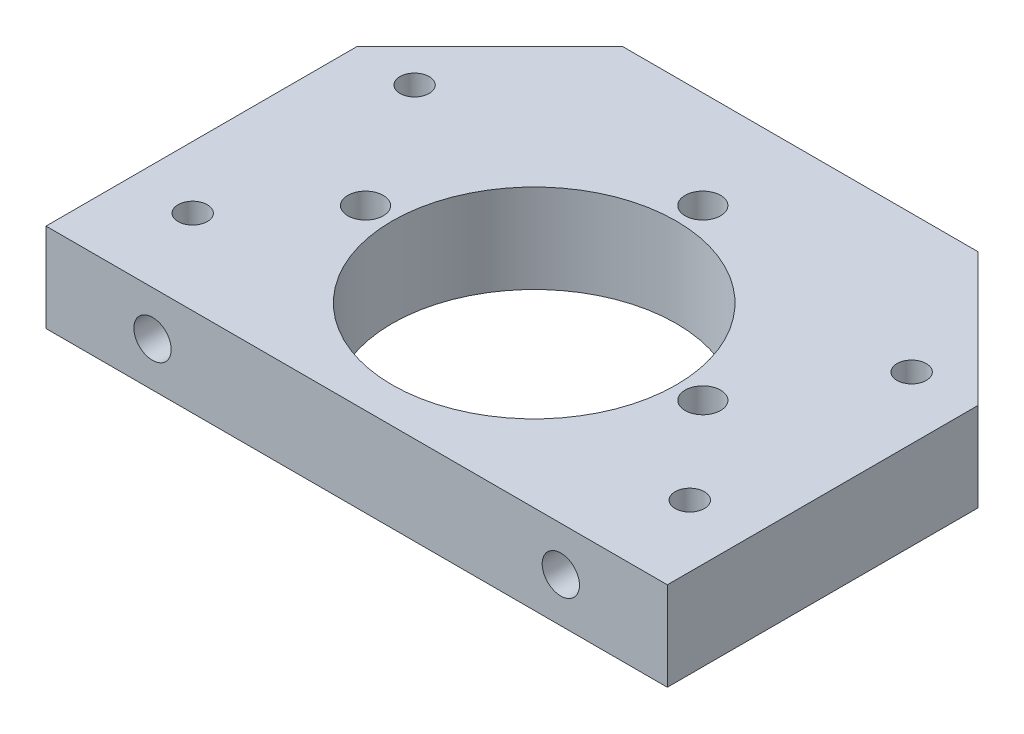
ISO-10303-21;
HEADER;
FILE_DESCRIPTION(('STEP AP214'),'2;1');
FILE_NAME('part.step','',(''),(''),'','','');
FILE_SCHEMA(('AUTOMOTIVE_DESIGN { 1 0 10303 214 1 1 1 1 }'));
ENDSEC;
DATA;
#1=APPLICATION_CONTEXT('core data for automotive mechanical design processes');
#2=APPLICATION_PROTOCOL_DEFINITION('international standard','automotive_design',2000,#1);
#3=PRODUCT_CONTEXT('',#1,'mechanical');
#4=PRODUCT('Part','Part','',(#3));
#5=PRODUCT_RELATED_PRODUCT_CATEGORY('part','',(#4));
#6=PRODUCT_DEFINITION_FORMATION('','',#4);
#7=PRODUCT_DEFINITION_CONTEXT('part definition',#1,'design');
#8=PRODUCT_DEFINITION('design','',#6,#7);
#9=PRODUCT_DEFINITION_SHAPE('','',#8);
#10=(LENGTH_UNIT() NAMED_UNIT(*) SI_UNIT(.MILLI.,.METRE.));
#11=(NAMED_UNIT(*) PLANE_ANGLE_UNIT() SI_UNIT($,.RADIAN.));
#12=(NAMED_UNIT(*) SI_UNIT($,.STERADIAN.) SOLID_ANGLE_UNIT());
#13=UNCERTAINTY_MEASURE_WITH_UNIT(LENGTH_MEASURE(1.E-05),#10,'distance_accuracy_value','');
#14=(GEOMETRIC_REPRESENTATION_CONTEXT(3) GLOBAL_UNCERTAINTY_ASSIGNED_CONTEXT((#13)) GLOBAL_UNIT_ASSIGNED_CONTEXT((#10,
#11,#12)) REPRESENTATION_CONTEXT('',''));
#15=CARTESIAN_POINT('',(0.,0.,0.));
#16=DIRECTION('',(0.,0.,1.));
#17=DIRECTION('',(1.,0.,0.));
#18=AXIS2_PLACEMENT_3D('',#15,#16,#17);
#19=CARTESIAN_POINT('',(0.,10.,0.));
#20=DIRECTION('',(0.,1.,0.));
#21=DIRECTION('',(0.,0.,1.));
#22=AXIS2_PLACEMENT_3D('',#19,#20,#21);
#23=PLANE('',#22);
#24=CARTESIAN_POINT('',(-14.8771673276373,10.,16.7188121657054));
#25=DIRECTION('',(0.,1.,0.));
#26=DIRECTION('',(0.,0.,1.));
#27=AXIS2_PLACEMENT_3D('',#24,#25,#26);
#28=CIRCLE('',#27,1.65000000000818);
#29=CARTESIAN_POINT('',(-14.8771673276373,10.,18.3688121657136));
#30=VERTEX_POINT('',#29);
#31=EDGE_CURVE('E189',#30,#30,#28,.T.);
#32=ORIENTED_EDGE('',*,*,#31,.F.);
#33=EDGE_LOOP('',(#32));
#34=FACE_BOUND('',#33,.T.);
#35=CARTESIAN_POINT('',(-14.8771673276373,10.,-8.28118783429458));
#36=DIRECTION('',(0.,1.,0.));
#37=DIRECTION('',(0.,0.,1.));
#38=AXIS2_PLACEMENT_3D('',#35,#36,#37);
#39=CIRCLE('',#38,1.65000000000818);
#40=CARTESIAN_POINT('',(-14.8771673276373,10.,-6.6311878342864));
#41=VERTEX_POINT('',#40);
#42=EDGE_CURVE('E183',#41,#41,#39,.T.);
#43=ORIENTED_EDGE('',*,*,#42,.F.);
#44=EDGE_LOOP('',(#43));
#45=FACE_BOUND('',#44,.T.);
#46=CARTESIAN_POINT('',(41.1228326723627,10.,16.7188121657055));
#47=DIRECTION('',(0.,1.,0.));
#48=DIRECTION('',(0.,0.,1.));
#49=AXIS2_PLACEMENT_3D('',#46,#47,#48);
#50=CIRCLE('',#49,1.65000000000818);
#51=CARTESIAN_POINT('',(41.1228326723627,10.,18.3688121657136));
#52=VERTEX_POINT('',#51);
#53=EDGE_CURVE('E177',#52,#52,#50,.T.);
#54=ORIENTED_EDGE('',*,*,#53,.F.);
#55=EDGE_LOOP('',(#54));
#56=FACE_BOUND('',#55,.T.);
#57=CARTESIAN_POINT('',(41.1228326723627,10.,-8.28118783429454));
#58=DIRECTION('',(0.,1.,0.));
#59=DIRECTION('',(0.,0.,1.));
#60=AXIS2_PLACEMENT_3D('',#57,#58,#59);
#61=CIRCLE('',#60,1.65000000000817);
#62=CARTESIAN_POINT('',(41.1228326723627,10.,-6.63118783428637));
#63=VERTEX_POINT('',#62);
#64=EDGE_CURVE('E171',#63,#63,#61,.T.);
#65=ORIENTED_EDGE('',*,*,#64,.F.);
#66=EDGE_LOOP('',(#65));
#67=FACE_BOUND('',#66,.T.);
#68=CARTESIAN_POINT('',(-5.87716732763728,10.,6.24381216570732));
#69=DIRECTION('',(0.,1.,0.));
#70=DIRECTION('',(0.,0.,1.));
#71=AXIS2_PLACEMENT_3D('',#68,#69,#70);
#72=CIRCLE('',#71,2.0000000000066);
#73=CARTESIAN_POINT('',(-5.87716732763728,10.,8.24381216571392));
#74=VERTEX_POINT('',#73);
#75=EDGE_CURVE('E165',#74,#74,#72,.T.);
#76=ORIENTED_EDGE('',*,*,#75,.F.);
#77=EDGE_LOOP('',(#76));
#78=FACE_BOUND('',#77,.T.);
#79=CARTESIAN_POINT('',(13.1228326723623,10.,-12.7561878342931));
#80=DIRECTION('',(0.,1.,0.));
#81=DIRECTION('',(0.,0.,1.));
#82=AXIS2_PLACEMENT_3D('',#79,#80,#81);
#83=CIRCLE('',#82,2.00000000000654);
#84=CARTESIAN_POINT('',(13.1228326723623,10.,-10.7561878342866));
#85=VERTEX_POINT('',#84);
#86=EDGE_CURVE('E159',#85,#85,#83,.T.);
#87=ORIENTED_EDGE('',*,*,#86,.F.);
#88=EDGE_LOOP('',(#87));
#89=FACE_BOUND('',#88,.T.);
#90=CARTESIAN_POINT('',(32.1228326723627,10.,6.2438121657064));
#91=DIRECTION('',(0.,1.,0.));
#92=DIRECTION('',(0.,0.,1.));
#93=AXIS2_PLACEMENT_3D('',#90,#91,#92);
#94=CIRCLE('',#93,2.00000000000664);
#95=CARTESIAN_POINT('',(32.1228326723627,10.,8.24381216571304));
#96=VERTEX_POINT('',#95);
#97=EDGE_CURVE('E153',#96,#96,#94,.T.);
#98=ORIENTED_EDGE('',*,*,#97,.F.);
#99=EDGE_LOOP('',(#98));
#100=FACE_BOUND('',#99,.T.);
#101=DIRECTION('',(0.,0.,-1.));
#102=VECTOR('',#101,1.);
#103=CARTESIAN_POINT('',(48.1228326723696,10.,-23.7561878342981));
#104=LINE('',#103,#102);
#105=CARTESIAN_POINT('',(48.1228326723696,10.,26.2438121657019));
#106=VERTEX_POINT('',#105);
#107=CARTESIAN_POINT('',(48.1228326723696,10.,-8.75618783429801));
#108=VERTEX_POINT('',#107);
#109=EDGE_CURVE('E102',#106,#108,#104,.T.);
#110=ORIENTED_EDGE('',*,*,#109,.T.);
#111=DIRECTION('',(0.707106781186547,0.,0.707106781186548));
#112=VECTOR('',#111,1.);
#113=CARTESIAN_POINT('',(28.4395102533338,10.,-28.4395102533338));
#114=LINE('',#113,#112);
#115=CARTESIAN_POINT('',(33.1228326723695,10.,-23.7561878342981));
#116=VERTEX_POINT('',#115);
#117=EDGE_CURVE('E41',#108,#116,#114,.F.);
#118=ORIENTED_EDGE('',*,*,#117,.T.);
#119=DIRECTION('',(-1.,0.,0.));
#120=VECTOR('',#119,1.);
#121=CARTESIAN_POINT('',(-21.8771673276304,10.,-23.7561878342981));
#122=LINE('',#121,#120);
#123=CARTESIAN_POINT('',(-6.87716732763038,10.,-23.7561878342981));
#124=VERTEX_POINT('',#123);
#125=EDGE_CURVE('E112',#116,#124,#122,.T.);
#126=ORIENTED_EDGE('',*,*,#125,.T.);
#127=DIRECTION('',(0.707106781186549,0.,-0.707106781186546));
#128=VECTOR('',#127,1.);
#129=CARTESIAN_POINT('',(-15.3166775809642,10.,-15.3166775809643));
#130=LINE('',#129,#128);
#131=CARTESIAN_POINT('',(-21.8771673276304,10.,-8.75618783429808));
#132=VERTEX_POINT('',#131);
#133=EDGE_CURVE('E48',#124,#132,#130,.F.);
#134=ORIENTED_EDGE('',*,*,#133,.T.);
#135=DIRECTION('',(0.,0.,1.));
#136=VECTOR('',#135,1.);
#137=CARTESIAN_POINT('',(-21.8771673276304,10.,-23.7561878342981));
#138=LINE('',#137,#136);
#139=CARTESIAN_POINT('',(-21.8771673276304,10.,26.2438121657019));
#140=VERTEX_POINT('',#139);
#141=EDGE_CURVE('E86',#132,#140,#138,.T.);
#142=ORIENTED_EDGE('',*,*,#141,.T.);
#143=DIRECTION('',(1.,0.,0.));
#144=VECTOR('',#143,1.);
#145=CARTESIAN_POINT('',(-21.8771673276304,10.,26.2438121657019));
#146=LINE('',#145,#144);
#147=EDGE_CURVE('E89',#140,#106,#146,.T.);
#148=ORIENTED_EDGE('',*,*,#147,.T.);
#149=EDGE_LOOP('',(#110,#118,#126,#134,#142,#148));
#150=FACE_BOUND('',#149,.T.);
#151=CARTESIAN_POINT('',(13.1228326723696,10.,6.24381216570193));
#152=DIRECTION('',(0.,1.,0.));
#153=DIRECTION('',(0.,0.,1.));
#154=AXIS2_PLACEMENT_3D('',#151,#152,#153);
#155=CIRCLE('',#154,16.);
#156=CARTESIAN_POINT('',(13.1228326723696,10.,22.2438121657019));
#157=VERTEX_POINT('',#156);
#158=EDGE_CURVE('E144',#157,#157,#155,.T.);
#159=ORIENTED_EDGE('',*,*,#158,.F.);
#160=EDGE_LOOP('',(#159));
#161=FACE_BOUND('',#160,.T.);
#162=ADVANCED_FACE('F33',(#34,#45,#56,#67,#78,#89,#100,#150,#161),#23,.T.);
#163=CARTESIAN_POINT('',(0.,0.,0.));
#164=DIRECTION('',(0.,1.,0.));
#165=DIRECTION('',(0.,0.,1.));
#166=AXIS2_PLACEMENT_3D('',#163,#164,#165);
#167=PLANE('',#166);
#168=CARTESIAN_POINT('',(-14.8771673276373,0.,16.7188121657054));
#169=DIRECTION('',(0.,1.,0.));
#170=DIRECTION('',(0.,0.,1.));
#171=AXIS2_PLACEMENT_3D('',#168,#169,#170);
#172=CIRCLE('',#171,1.65000000000818);
#173=CARTESIAN_POINT('',(-14.8771673276373,0.,18.3688121657136));
#174=VERTEX_POINT('',#173);
#175=EDGE_CURVE('E186',#174,#174,#172,.T.);
#176=ORIENTED_EDGE('',*,*,#175,.T.);
#177=EDGE_LOOP('',(#176));
#178=FACE_BOUND('',#177,.T.);
#179=CARTESIAN_POINT('',(-14.8771673276373,0.,-8.28118783429458));
#180=DIRECTION('',(0.,1.,0.));
#181=DIRECTION('',(0.,0.,1.));
#182=AXIS2_PLACEMENT_3D('',#179,#180,#181);
#183=CIRCLE('',#182,1.65000000000818);
#184=CARTESIAN_POINT('',(-14.8771673276373,0.,-6.6311878342864));
#185=VERTEX_POINT('',#184);
#186=EDGE_CURVE('E180',#185,#185,#183,.T.);
#187=ORIENTED_EDGE('',*,*,#186,.T.);
#188=EDGE_LOOP('',(#187));
#189=FACE_BOUND('',#188,.T.);
#190=CARTESIAN_POINT('',(41.1228326723627,0.,16.7188121657055));
#191=DIRECTION('',(0.,1.,0.));
#192=DIRECTION('',(0.,0.,1.));
#193=AXIS2_PLACEMENT_3D('',#190,#191,#192);
#194=CIRCLE('',#193,1.65000000000818);
#195=CARTESIAN_POINT('',(41.1228326723627,0.,18.3688121657136));
#196=VERTEX_POINT('',#195);
#197=EDGE_CURVE('E174',#196,#196,#194,.T.);
#198=ORIENTED_EDGE('',*,*,#197,.T.);
#199=EDGE_LOOP('',(#198));
#200=FACE_BOUND('',#199,.T.);
#201=CARTESIAN_POINT('',(41.1228326723627,0.,-8.28118783429454));
#202=DIRECTION('',(0.,1.,0.));
#203=DIRECTION('',(0.,0.,1.));
#204=AXIS2_PLACEMENT_3D('',#201,#202,#203);
#205=CIRCLE('',#204,1.65000000000817);
#206=CARTESIAN_POINT('',(41.1228326723627,0.,-6.63118783428637));
#207=VERTEX_POINT('',#206);
#208=EDGE_CURVE('E168',#207,#207,#205,.T.);
#209=ORIENTED_EDGE('',*,*,#208,.T.);
#210=EDGE_LOOP('',(#209));
#211=FACE_BOUND('',#210,.T.);
#212=CARTESIAN_POINT('',(-5.87716732763728,0.,6.24381216570732));
#213=DIRECTION('',(0.,1.,0.));
#214=DIRECTION('',(0.,0.,1.));
#215=AXIS2_PLACEMENT_3D('',#212,#213,#214);
#216=CIRCLE('',#215,2.0000000000066);
#217=CARTESIAN_POINT('',(-5.87716732763728,0.,8.24381216571392));
#218=VERTEX_POINT('',#217);
#219=EDGE_CURVE('E162',#218,#218,#216,.T.);
#220=ORIENTED_EDGE('',*,*,#219,.T.);
#221=EDGE_LOOP('',(#220));
#222=FACE_BOUND('',#221,.T.);
#223=CARTESIAN_POINT('',(13.1228326723623,0.,-12.7561878342931));
#224=DIRECTION('',(0.,1.,0.));
#225=DIRECTION('',(0.,0.,1.));
#226=AXIS2_PLACEMENT_3D('',#223,#224,#225);
#227=CIRCLE('',#226,2.00000000000654);
#228=CARTESIAN_POINT('',(13.1228326723623,0.,-10.7561878342866));
#229=VERTEX_POINT('',#228);
#230=EDGE_CURVE('E156',#229,#229,#227,.T.);
#231=ORIENTED_EDGE('',*,*,#230,.T.);
#232=EDGE_LOOP('',(#231));
#233=FACE_BOUND('',#232,.T.);
#234=CARTESIAN_POINT('',(32.1228326723627,0.,6.2438121657064));
#235=DIRECTION('',(0.,1.,0.));
#236=DIRECTION('',(0.,0.,1.));
#237=AXIS2_PLACEMENT_3D('',#234,#235,#236);
#238=CIRCLE('',#237,2.00000000000664);
#239=CARTESIAN_POINT('',(32.1228326723627,0.,8.24381216571304));
#240=VERTEX_POINT('',#239);
#241=EDGE_CURVE('E150',#240,#240,#238,.T.);
#242=ORIENTED_EDGE('',*,*,#241,.T.);
#243=EDGE_LOOP('',(#242));
#244=FACE_BOUND('',#243,.T.);
#245=DIRECTION('',(-1.,0.,0.));
#246=VECTOR('',#245,1.);
#247=CARTESIAN_POINT('',(-21.8771673276304,0.,-23.7561878342981));
#248=LINE('',#247,#246);
#249=CARTESIAN_POINT('',(33.1228326723695,0.,-23.7561878342981));
#250=VERTEX_POINT('',#249);
#251=CARTESIAN_POINT('',(-6.87716732763038,0.,-23.7561878342981));
#252=VERTEX_POINT('',#251);
#253=EDGE_CURVE('E94',#250,#252,#248,.T.);
#254=ORIENTED_EDGE('',*,*,#253,.F.);
#255=DIRECTION('',(-0.707106781186547,0.,-0.707106781186548));
#256=VECTOR('',#255,1.);
#257=CARTESIAN_POINT('',(33.1228326723696,0.,-23.7561878342981));
#258=LINE('',#257,#256);
#259=CARTESIAN_POINT('',(48.1228326723696,0.,-8.75618783429803));
#260=VERTEX_POINT('',#259);
#261=EDGE_CURVE('E120',#250,#260,#258,.F.);
#262=ORIENTED_EDGE('',*,*,#261,.T.);
#263=DIRECTION('',(0.,0.,-1.));
#264=VECTOR('',#263,1.);
#265=CARTESIAN_POINT('',(48.1228326723696,0.,-23.7561878342981));
#266=LINE('',#265,#264);
#267=CARTESIAN_POINT('',(48.1228326723696,0.,26.2438121657019));
#268=VERTEX_POINT('',#267);
#269=EDGE_CURVE('E138',#268,#260,#266,.T.);
#270=ORIENTED_EDGE('',*,*,#269,.F.);
#271=DIRECTION('',(1.,0.,0.));
#272=VECTOR('',#271,1.);
#273=CARTESIAN_POINT('',(-21.8771673276304,0.,26.2438121657019));
#274=LINE('',#273,#272);
#275=CARTESIAN_POINT('',(-21.8771673276304,0.,26.2438121657019));
#276=VERTEX_POINT('',#275);
#277=EDGE_CURVE('E140',#276,#268,#274,.T.);
#278=ORIENTED_EDGE('',*,*,#277,.F.);
#279=DIRECTION('',(0.,0.,1.));
#280=VECTOR('',#279,1.);
#281=CARTESIAN_POINT('',(-21.8771673276304,0.,-23.7561878342981));
#282=LINE('',#281,#280);
#283=CARTESIAN_POINT('',(-21.8771673276304,0.,-8.75618783429808));
#284=VERTEX_POINT('',#283);
#285=EDGE_CURVE('E106',#284,#276,#282,.T.);
#286=ORIENTED_EDGE('',*,*,#285,.F.);
#287=DIRECTION('',(-0.707106781186549,0.,0.707106781186546));
#288=VECTOR('',#287,1.);
#289=CARTESIAN_POINT('',(-21.8771673276304,0.,-8.75618783429807));
#290=LINE('',#289,#288);
#291=EDGE_CURVE('E118',#284,#252,#290,.F.);
#292=ORIENTED_EDGE('',*,*,#291,.T.);
#293=EDGE_LOOP('',(#254,#262,#270,#278,#286,#292));
#294=FACE_BOUND('',#293,.T.);
#295=CARTESIAN_POINT('',(13.1228326723696,0.,6.24381216570193));
#296=DIRECTION('',(0.,1.,0.));
#297=DIRECTION('',(0.,0.,1.));
#298=AXIS2_PLACEMENT_3D('',#295,#296,#297);
#299=CIRCLE('',#298,16.);
#300=CARTESIAN_POINT('',(13.1228326723696,0.,22.2438121657019));
#301=VERTEX_POINT('',#300);
#302=EDGE_CURVE('E147',#301,#301,#299,.T.);
#303=ORIENTED_EDGE('',*,*,#302,.T.);
#304=EDGE_LOOP('',(#303));
#305=FACE_BOUND('',#304,.T.);
#306=ADVANCED_FACE('F136',(#178,#189,#200,#211,#222,#233,#244,#294,#305),#167,.F.);
#307=CARTESIAN_POINT('',(-21.8771673276304,10.,-23.7561878342981));
#308=DIRECTION('',(1.,0.,0.));
#309=DIRECTION('',(0.,0.,-1.));
#310=AXIS2_PLACEMENT_3D('',#307,#308,#309);
#311=PLANE('',#310);
#312=ORIENTED_EDGE('',*,*,#141,.F.);
#313=DIRECTION('',(0.,-1.,0.));
#314=VECTOR('',#313,1.);
#315=CARTESIAN_POINT('',(-21.8771673276304,10.,-8.75618783429807));
#316=LINE('',#315,#314);
#317=EDGE_CURVE('E11',#132,#284,#316,.T.);
#318=ORIENTED_EDGE('',*,*,#317,.T.);
#319=ORIENTED_EDGE('',*,*,#285,.T.);
#320=DIRECTION('',(0.,-1.,0.));
#321=VECTOR('',#320,1.);
#322=CARTESIAN_POINT('',(-21.8771673276304,10.,26.2438121657019));
#323=LINE('',#322,#321);
#324=EDGE_CURVE('E99',#140,#276,#323,.T.);
#325=ORIENTED_EDGE('',*,*,#324,.F.);
#326=EDGE_LOOP('',(#312,#318,#319,#325));
#327=FACE_BOUND('',#326,.T.);
#328=ADVANCED_FACE('F104',(#327),#311,.F.);
#329=CARTESIAN_POINT('',(-21.8771673276304,10.,26.2438121657019));
#330=DIRECTION('',(0.,0.,-1.));
#331=DIRECTION('',(-1.,0.,0.));
#332=AXIS2_PLACEMENT_3D('',#329,#330,#331);
#333=PLANE('',#332);
#334=CARTESIAN_POINT('',(36.1228326723696,5.,26.2438121657019));
#335=DIRECTION('',(0.,0.,1.));
#336=DIRECTION('',(1.,0.,0.));
#337=AXIS2_PLACEMENT_3D('',#334,#335,#336);
#338=CIRCLE('',#337,2.1);
#339=CARTESIAN_POINT('',(38.2228326723696,5.,26.2438121657019));
#340=VERTEX_POINT('',#339);
#341=EDGE_CURVE('E201',#340,#340,#338,.T.);
#342=ORIENTED_EDGE('',*,*,#341,.F.);
#343=EDGE_LOOP('',(#342));
#344=FACE_BOUND('',#343,.T.);
#345=CARTESIAN_POINT('',(-9.87716732763041,5.,26.2438121657019));
#346=DIRECTION('',(0.,0.,1.));
#347=DIRECTION('',(1.,0.,0.));
#348=AXIS2_PLACEMENT_3D('',#345,#346,#347);
#349=CIRCLE('',#348,2.1);
#350=CARTESIAN_POINT('',(-7.77716732763041,5.,26.2438121657019));
#351=VERTEX_POINT('',#350);
#352=EDGE_CURVE('E195',#351,#351,#349,.T.);
#353=ORIENTED_EDGE('',*,*,#352,.F.);
#354=EDGE_LOOP('',(#353));
#355=FACE_BOUND('',#354,.T.);
#356=ORIENTED_EDGE('',*,*,#277,.T.);
#357=DIRECTION('',(0.,-1.,0.));
#358=VECTOR('',#357,1.);
#359=CARTESIAN_POINT('',(48.1228326723696,10.,26.2438121657019));
#360=LINE('',#359,#358);
#361=EDGE_CURVE('E101',#106,#268,#360,.T.);
#362=ORIENTED_EDGE('',*,*,#361,.F.);
#363=ORIENTED_EDGE('',*,*,#147,.F.);
#364=ORIENTED_EDGE('',*,*,#324,.T.);
#365=EDGE_LOOP('',(#356,#362,#363,#364));
#366=FACE_BOUND('',#365,.T.);
#367=ADVANCED_FACE('F98',(#344,#355,#366),#333,.F.);
#368=CARTESIAN_POINT('',(48.1228326723696,10.,-23.7561878342981));
#369=DIRECTION('',(-1.,0.,0.));
#370=DIRECTION('',(0.,0.,1.));
#371=AXIS2_PLACEMENT_3D('',#368,#369,#370);
#372=PLANE('',#371);
#373=ORIENTED_EDGE('',*,*,#269,.T.);
#374=DIRECTION('',(0.,1.,0.));
#375=VECTOR('',#374,1.);
#376=CARTESIAN_POINT('',(48.1228326723696,10.,-8.75618783429802));
#377=LINE('',#376,#375);
#378=EDGE_CURVE('E56',#260,#108,#377,.T.);
#379=ORIENTED_EDGE('',*,*,#378,.T.);
#380=ORIENTED_EDGE('',*,*,#109,.F.);
#381=ORIENTED_EDGE('',*,*,#361,.T.);
#382=EDGE_LOOP('',(#373,#379,#380,#381));
#383=FACE_BOUND('',#382,.T.);
#384=ADVANCED_FACE('F139',(#383),#372,.F.);
#385=CARTESIAN_POINT('',(-21.8771673276304,10.,-23.7561878342981));
#386=DIRECTION('',(0.,0.,1.));
#387=DIRECTION('',(1.,0.,0.));
#388=AXIS2_PLACEMENT_3D('',#385,#386,#387);
#389=PLANE('',#388);
#390=ORIENTED_EDGE('',*,*,#125,.F.);
#391=DIRECTION('',(0.,-1.,0.));
#392=VECTOR('',#391,1.);
#393=CARTESIAN_POINT('',(33.1228326723696,10.,-23.7561878342981));
#394=LINE('',#393,#392);
#395=EDGE_CURVE('E110',#116,#250,#394,.T.);
#396=ORIENTED_EDGE('',*,*,#395,.T.);
#397=ORIENTED_EDGE('',*,*,#253,.T.);
#398=DIRECTION('',(0.,1.,0.));
#399=VECTOR('',#398,1.);
#400=CARTESIAN_POINT('',(-6.87716732763038,10.,-23.7561878342981));
#401=LINE('',#400,#399);
#402=EDGE_CURVE('E108',#252,#124,#401,.T.);
#403=ORIENTED_EDGE('',*,*,#402,.T.);
#404=EDGE_LOOP('',(#390,#396,#397,#403));
#405=FACE_BOUND('',#404,.T.);
#406=ADVANCED_FACE('F128',(#405),#389,.F.);
#407=CARTESIAN_POINT('',(13.1228326723696,10.,6.24381216570193));
#408=DIRECTION('',(0.,-1.,0.));
#409=DIRECTION('',(0.,0.,-1.));
#410=AXIS2_PLACEMENT_3D('',#407,#408,#409);
#411=CYLINDRICAL_SURFACE('',#410,16.);
#412=ORIENTED_EDGE('',*,*,#158,.T.);
#413=EDGE_LOOP('',(#412));
#414=FACE_BOUND('',#413,.T.);
#415=ORIENTED_EDGE('',*,*,#302,.F.);
#416=EDGE_LOOP('',(#415));
#417=FACE_BOUND('',#416,.T.);
#418=ADVANCED_FACE('F248',(#414,#417),#411,.F.);
#419=CARTESIAN_POINT('',(33.1228326723696,10.,-23.7561878342981));
#420=DIRECTION('',(-0.707106781186548,0.,0.707106781186547));
#421=DIRECTION('',(0.,-1.,0.));
#422=AXIS2_PLACEMENT_3D('',#419,#420,#421);
#423=PLANE('',#422);
#424=ORIENTED_EDGE('',*,*,#117,.F.);
#425=ORIENTED_EDGE('',*,*,#378,.F.);
#426=ORIENTED_EDGE('',*,*,#261,.F.);
#427=ORIENTED_EDGE('',*,*,#395,.F.);
#428=EDGE_LOOP('',(#424,#425,#426,#427));
#429=FACE_BOUND('',#428,.T.);
#430=ADVANCED_FACE('F133',(#429),#423,.F.);
#431=CARTESIAN_POINT('',(-21.8771673276304,10.,-8.75618783429807));
#432=DIRECTION('',(0.707106781186546,0.,0.707106781186549));
#433=DIRECTION('',(0.,-1.,0.));
#434=AXIS2_PLACEMENT_3D('',#431,#432,#433);
#435=PLANE('',#434);
#436=ORIENTED_EDGE('',*,*,#133,.F.);
#437=ORIENTED_EDGE('',*,*,#402,.F.);
#438=ORIENTED_EDGE('',*,*,#291,.F.);
#439=ORIENTED_EDGE('',*,*,#317,.F.);
#440=EDGE_LOOP('',(#436,#437,#438,#439));
#441=FACE_BOUND('',#440,.T.);
#442=ADVANCED_FACE('F35',(#441),#435,.F.);
#443=CARTESIAN_POINT('',(32.1228326723627,0.,6.2438121657064));
#444=DIRECTION('',(0.,1.,0.));
#445=DIRECTION('',(0.,0.,1.));
#446=AXIS2_PLACEMENT_3D('',#443,#444,#445);
#447=CYLINDRICAL_SURFACE('',#446,2.00000000000664);
#448=ORIENTED_EDGE('',*,*,#241,.F.);
#449=EDGE_LOOP('',(#448));
#450=FACE_BOUND('',#449,.T.);
#451=ORIENTED_EDGE('',*,*,#97,.T.);
#452=EDGE_LOOP('',(#451));
#453=FACE_BOUND('',#452,.T.);
#454=ADVANCED_FACE('F261',(#450,#453),#447,.F.);
#455=CARTESIAN_POINT('',(13.1228326723623,0.,-12.7561878342931));
#456=DIRECTION('',(0.,1.,0.));
#457=DIRECTION('',(0.,0.,1.));
#458=AXIS2_PLACEMENT_3D('',#455,#456,#457);
#459=CYLINDRICAL_SURFACE('',#458,2.00000000000654);
#460=ORIENTED_EDGE('',*,*,#230,.F.);
#461=EDGE_LOOP('',(#460));
#462=FACE_BOUND('',#461,.T.);
#463=ORIENTED_EDGE('',*,*,#86,.T.);
#464=EDGE_LOOP('',(#463));
#465=FACE_BOUND('',#464,.T.);
#466=ADVANCED_FACE('F365',(#462,#465),#459,.F.);
#467=CARTESIAN_POINT('',(-5.87716732763728,0.,6.24381216570732));
#468=DIRECTION('',(0.,1.,0.));
#469=DIRECTION('',(0.,0.,1.));
#470=AXIS2_PLACEMENT_3D('',#467,#468,#469);
#471=CYLINDRICAL_SURFACE('',#470,2.0000000000066);
#472=ORIENTED_EDGE('',*,*,#219,.F.);
#473=EDGE_LOOP('',(#472));
#474=FACE_BOUND('',#473,.T.);
#475=ORIENTED_EDGE('',*,*,#75,.T.);
#476=EDGE_LOOP('',(#475));
#477=FACE_BOUND('',#476,.T.);
#478=ADVANCED_FACE('F307',(#474,#477),#471,.F.);
#479=CARTESIAN_POINT('',(41.1228326723627,0.,-8.28118783429454));
#480=DIRECTION('',(0.,1.,0.));
#481=DIRECTION('',(0.,0.,1.));
#482=AXIS2_PLACEMENT_3D('',#479,#480,#481);
#483=CYLINDRICAL_SURFACE('',#482,1.65000000000817);
#484=ORIENTED_EDGE('',*,*,#208,.F.);
#485=EDGE_LOOP('',(#484));
#486=FACE_BOUND('',#485,.T.);
#487=ORIENTED_EDGE('',*,*,#64,.T.);
#488=EDGE_LOOP('',(#487));
#489=FACE_BOUND('',#488,.T.);
#490=ADVANCED_FACE('F301',(#486,#489),#483,.F.);
#491=CARTESIAN_POINT('',(41.1228326723627,0.,16.7188121657055));
#492=DIRECTION('',(0.,1.,0.));
#493=DIRECTION('',(0.,0.,1.));
#494=AXIS2_PLACEMENT_3D('',#491,#492,#493);
#495=CYLINDRICAL_SURFACE('',#494,1.65000000000818);
#496=ORIENTED_EDGE('',*,*,#197,.F.);
#497=EDGE_LOOP('',(#496));
#498=FACE_BOUND('',#497,.T.);
#499=ORIENTED_EDGE('',*,*,#53,.T.);
#500=EDGE_LOOP('',(#499));
#501=FACE_BOUND('',#500,.T.);
#502=ADVANCED_FACE('F306',(#498,#501),#495,.F.);
#503=CARTESIAN_POINT('',(-14.8771673276373,0.,-8.28118783429458));
#504=DIRECTION('',(0.,1.,0.));
#505=DIRECTION('',(0.,0.,1.));
#506=AXIS2_PLACEMENT_3D('',#503,#504,#505);
#507=CYLINDRICAL_SURFACE('',#506,1.65000000000818);
#508=ORIENTED_EDGE('',*,*,#186,.F.);
#509=EDGE_LOOP('',(#508));
#510=FACE_BOUND('',#509,.T.);
#511=ORIENTED_EDGE('',*,*,#42,.T.);
#512=EDGE_LOOP('',(#511));
#513=FACE_BOUND('',#512,.T.);
#514=ADVANCED_FACE('F232',(#510,#513),#507,.F.);
#515=CARTESIAN_POINT('',(-14.8771673276373,0.,16.7188121657054));
#516=DIRECTION('',(0.,1.,0.));
#517=DIRECTION('',(0.,0.,1.));
#518=AXIS2_PLACEMENT_3D('',#515,#516,#517);
#519=CYLINDRICAL_SURFACE('',#518,1.65000000000818);
#520=ORIENTED_EDGE('',*,*,#175,.F.);
#521=EDGE_LOOP('',(#520));
#522=FACE_BOUND('',#521,.T.);
#523=ORIENTED_EDGE('',*,*,#31,.T.);
#524=EDGE_LOOP('',(#523));
#525=FACE_BOUND('',#524,.T.);
#526=ADVANCED_FACE('F223',(#522,#525),#519,.F.);
#527=CARTESIAN_POINT('',(-9.87716732763041,5.,11.2438121657019));
#528=DIRECTION('',(0.,0.,1.));
#529=DIRECTION('',(1.,0.,0.));
#530=AXIS2_PLACEMENT_3D('',#527,#528,#529);
#531=CYLINDRICAL_SURFACE('',#530,2.1);
#532=CARTESIAN_POINT('',(-9.87716732763041,5.,11.2438121657019));
#533=DIRECTION('',(0.,0.,1.));
#534=DIRECTION('',(1.,0.,0.));
#535=AXIS2_PLACEMENT_3D('',#532,#533,#534);
#536=CIRCLE('',#535,2.1);
#537=CARTESIAN_POINT('',(-7.77716732763041,5.,11.2438121657019));
#538=VERTEX_POINT('',#537);
#539=EDGE_CURVE('E192',#538,#538,#536,.T.);
#540=ORIENTED_EDGE('',*,*,#539,.F.);
#541=EDGE_LOOP('',(#540));
#542=FACE_BOUND('',#541,.T.);
#543=ORIENTED_EDGE('',*,*,#352,.T.);
#544=EDGE_LOOP('',(#543));
#545=FACE_BOUND('',#544,.T.);
#546=ADVANCED_FACE('F221',(#542,#545),#531,.F.);
#547=CARTESIAN_POINT('',(-9.87716732763041,5.,11.2438121657019));
#548=DIRECTION('',(0.,0.,1.));
#549=DIRECTION('',(1.,0.,0.));
#550=AXIS2_PLACEMENT_3D('',#547,#548,#549);
#551=PLANE('',#550);
#552=ORIENTED_EDGE('',*,*,#539,.T.);
#553=EDGE_LOOP('',(#552));
#554=FACE_BOUND('',#553,.T.);
#555=ADVANCED_FACE('F212',(#554),#551,.T.);
#556=CARTESIAN_POINT('',(36.1228326723696,5.,11.2438121657019));
#557=DIRECTION('',(0.,0.,1.));
#558=DIRECTION('',(1.,0.,0.));
#559=AXIS2_PLACEMENT_3D('',#556,#557,#558);
#560=CYLINDRICAL_SURFACE('',#559,2.1);
#561=CARTESIAN_POINT('',(36.1228326723696,5.,11.2438121657019));
#562=DIRECTION('',(0.,0.,1.));
#563=DIRECTION('',(1.,0.,0.));
#564=AXIS2_PLACEMENT_3D('',#561,#562,#563);
#565=CIRCLE('',#564,2.1);
#566=CARTESIAN_POINT('',(38.2228326723696,5.,11.2438121657019));
#567=VERTEX_POINT('',#566);
#568=EDGE_CURVE('E198',#567,#567,#565,.T.);
#569=ORIENTED_EDGE('',*,*,#568,.F.);
#570=EDGE_LOOP('',(#569));
#571=FACE_BOUND('',#570,.T.);
#572=ORIENTED_EDGE('',*,*,#341,.T.);
#573=EDGE_LOOP('',(#572));
#574=FACE_BOUND('',#573,.T.);
#575=ADVANCED_FACE('F209',(#571,#574),#560,.F.);
#576=CARTESIAN_POINT('',(36.1228326723696,5.,11.2438121657019));
#577=DIRECTION('',(0.,0.,1.));
#578=DIRECTION('',(1.,0.,0.));
#579=AXIS2_PLACEMENT_3D('',#576,#577,#578);
#580=PLANE('',#579);
#581=ORIENTED_EDGE('',*,*,#568,.T.);
#582=EDGE_LOOP('',(#581));
#583=FACE_BOUND('',#582,.T.);
#584=ADVANCED_FACE('F207',(#583),#580,.T.);
#585=CLOSED_SHELL('',(#162,#306,#328,#367,#384,#406,#418,#430,#442,#454,#466,#478,#490,#502,
#514,#526,#546,#555,#575,#584));
#586=MANIFOLD_SOLID_BREP('B2',#585);
#587=ADVANCED_BREP_SHAPE_REPRESENTATION('',(#18,#586),#14);
#588=SHAPE_DEFINITION_REPRESENTATION(#9,#587);
ENDSEC;
END-ISO-10303-21;
